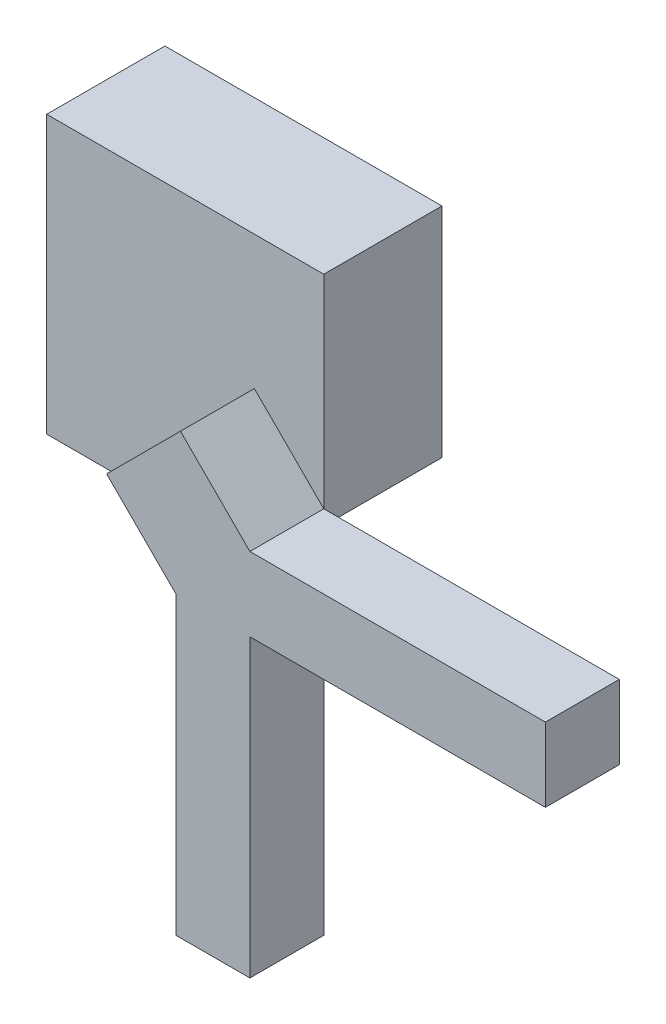
ISO-10303-21;
HEADER;
FILE_DESCRIPTION(('STEP AP214'),'2;1');
FILE_NAME('part.step','',(''),(''),'','','');
FILE_SCHEMA(('AUTOMOTIVE_DESIGN { 1 0 10303 214 1 1 1 1 }'));
ENDSEC;
DATA;
#1=APPLICATION_CONTEXT('core data for automotive mechanical design processes');
#2=APPLICATION_PROTOCOL_DEFINITION('international standard','automotive_design',2000,#1);
#3=PRODUCT_CONTEXT('',#1,'mechanical');
#4=PRODUCT('Part','Part','',(#3));
#5=PRODUCT_RELATED_PRODUCT_CATEGORY('part','',(#4));
#6=PRODUCT_DEFINITION_FORMATION('','',#4);
#7=PRODUCT_DEFINITION_CONTEXT('part definition',#1,'design');
#8=PRODUCT_DEFINITION('design','',#6,#7);
#9=PRODUCT_DEFINITION_SHAPE('','',#8);
#10=(LENGTH_UNIT() NAMED_UNIT(*) SI_UNIT(.MILLI.,.METRE.));
#11=(NAMED_UNIT(*) PLANE_ANGLE_UNIT() SI_UNIT($,.RADIAN.));
#12=(NAMED_UNIT(*) SI_UNIT($,.STERADIAN.) SOLID_ANGLE_UNIT());
#13=UNCERTAINTY_MEASURE_WITH_UNIT(LENGTH_MEASURE(1.E-05),#10,'distance_accuracy_value','');
#14=(GEOMETRIC_REPRESENTATION_CONTEXT(3) GLOBAL_UNCERTAINTY_ASSIGNED_CONTEXT((#13)) GLOBAL_UNIT_ASSIGNED_CONTEXT((#10,
#11,#12)) REPRESENTATION_CONTEXT('',''));
#15=CARTESIAN_POINT('',(0.,0.,0.));
#16=DIRECTION('',(0.,0.,1.));
#17=DIRECTION('',(1.,0.,0.));
#18=AXIS2_PLACEMENT_3D('',#15,#16,#17);
#19=CARTESIAN_POINT('',(9.375,9.375,8.));
#20=DIRECTION('',(-1.,0.,0.));
#21=DIRECTION('',(0.,-1.,0.));
#22=AXIS2_PLACEMENT_3D('',#19,#20,#21);
#23=PLANE('',#22);
#24=DIRECTION('',(0.,0.,-1.));
#25=VECTOR('',#24,1.);
#26=CARTESIAN_POINT('',(9.375,-5.375,13.6568542494924));
#27=LINE('',#26,#25);
#28=CARTESIAN_POINT('',(9.375,-5.375,8.));
#29=VERTEX_POINT('',#28);
#30=CARTESIAN_POINT('',(9.375,-5.375,0.));
#31=VERTEX_POINT('',#30);
#32=EDGE_CURVE('E51',#29,#31,#27,.T.);
#33=ORIENTED_EDGE('',*,*,#32,.T.);
#34=DIRECTION('',(0.,1.,0.));
#35=VECTOR('',#34,1.);
#36=CARTESIAN_POINT('',(9.375,9.375,0.));
#37=LINE('',#36,#35);
#38=CARTESIAN_POINT('',(9.375,9.375,0.));
#39=VERTEX_POINT('',#38);
#40=EDGE_CURVE('E186',#31,#39,#37,.T.);
#41=ORIENTED_EDGE('',*,*,#40,.T.);
#42=DIRECTION('',(0.,0.,-1.));
#43=VECTOR('',#42,1.);
#44=CARTESIAN_POINT('',(9.375,9.375,8.));
#45=LINE('',#44,#43);
#46=CARTESIAN_POINT('',(9.375,9.375,8.));
#47=VERTEX_POINT('',#46);
#48=EDGE_CURVE('E11',#47,#39,#45,.T.);
#49=ORIENTED_EDGE('',*,*,#48,.F.);
#50=DIRECTION('',(0.,1.,0.));
#51=VECTOR('',#50,1.);
#52=CARTESIAN_POINT('',(9.375,-4.375,8.));
#53=LINE('',#52,#51);
#54=CARTESIAN_POINT('',(9.375,-4.375,8.));
#55=VERTEX_POINT('',#54);
#56=EDGE_CURVE('E171',#55,#47,#53,.T.);
#57=ORIENTED_EDGE('',*,*,#56,.F.);
#58=EDGE_CURVE('E178',#29,#55,#53,.T.);
#59=ORIENTED_EDGE('',*,*,#58,.F.);
#60=EDGE_LOOP('',(#33,#41,#49,#57,#59));
#61=FACE_BOUND('',#60,.T.);
#62=ADVANCED_FACE('F37',(#61),#23,.F.);
#63=CARTESIAN_POINT('',(-9.375,-9.375,8.));
#64=DIRECTION('',(0.,1.,0.));
#65=DIRECTION('',(-1.,0.,0.));
#66=AXIS2_PLACEMENT_3D('',#63,#64,#65);
#67=PLANE('',#66);
#68=DIRECTION('',(0.,0.,-1.));
#69=VECTOR('',#68,1.);
#70=CARTESIAN_POINT('',(5.375,-9.375,13.6568542494924));
#71=LINE('',#70,#69);
#72=CARTESIAN_POINT('',(5.375,-9.375,8.));
#73=VERTEX_POINT('',#72);
#74=CARTESIAN_POINT('',(5.375,-9.375,0.));
#75=VERTEX_POINT('',#74);
#76=EDGE_CURVE('E148',#73,#75,#71,.T.);
#77=ORIENTED_EDGE('',*,*,#76,.F.);
#78=DIRECTION('',(1.,0.,0.));
#79=VECTOR('',#78,1.);
#80=CARTESIAN_POINT('',(4.375,-9.375,8.));
#81=LINE('',#80,#79);
#82=CARTESIAN_POINT('',(4.375,-9.375,8.));
#83=VERTEX_POINT('',#82);
#84=EDGE_CURVE('E159',#83,#73,#81,.T.);
#85=ORIENTED_EDGE('',*,*,#84,.F.);
#86=CARTESIAN_POINT('',(-9.375,-9.375,8.));
#87=VERTEX_POINT('',#86);
#88=EDGE_CURVE('E169',#87,#83,#81,.T.);
#89=ORIENTED_EDGE('',*,*,#88,.F.);
#90=DIRECTION('',(0.,0.,-1.));
#91=VECTOR('',#90,1.);
#92=CARTESIAN_POINT('',(-9.375,-9.375,8.));
#93=LINE('',#92,#91);
#94=CARTESIAN_POINT('',(-9.375,-9.375,0.));
#95=VERTEX_POINT('',#94);
#96=EDGE_CURVE('E185',#87,#95,#93,.T.);
#97=ORIENTED_EDGE('',*,*,#96,.T.);
#98=DIRECTION('',(1.,0.,0.));
#99=VECTOR('',#98,1.);
#100=CARTESIAN_POINT('',(-9.375,-9.375,0.));
#101=LINE('',#100,#99);
#102=EDGE_CURVE('E162',#95,#75,#101,.T.);
#103=ORIENTED_EDGE('',*,*,#102,.T.);
#104=EDGE_LOOP('',(#77,#85,#89,#97,#103));
#105=FACE_BOUND('',#104,.T.);
#106=ADVANCED_FACE('F158',(#105),#67,.F.);
#107=CARTESIAN_POINT('',(0.,0.,0.));
#108=DIRECTION('',(0.,0.,-1.));
#109=DIRECTION('',(-1.,0.,0.));
#110=AXIS2_PLACEMENT_3D('',#107,#108,#109);
#111=PLANE('',#110);
#112=ORIENTED_EDGE('',*,*,#40,.F.);
#113=DIRECTION('',(-1.,0.,0.));
#114=VECTOR('',#113,1.);
#115=CARTESIAN_POINT('',(9.375,-5.375,0.));
#116=LINE('',#115,#114);
#117=CARTESIAN_POINT('',(5.375,-5.375,0.));
#118=VERTEX_POINT('',#117);
#119=EDGE_CURVE('E205',#31,#118,#116,.T.);
#120=ORIENTED_EDGE('',*,*,#119,.T.);
#121=DIRECTION('',(0.,-1.,0.));
#122=VECTOR('',#121,1.);
#123=CARTESIAN_POINT('',(5.375,-9.375,0.));
#124=LINE('',#123,#122);
#125=EDGE_CURVE('E163',#118,#75,#124,.T.);
#126=ORIENTED_EDGE('',*,*,#125,.T.);
#127=ORIENTED_EDGE('',*,*,#102,.F.);
#128=DIRECTION('',(0.,-1.,0.));
#129=VECTOR('',#128,1.);
#130=CARTESIAN_POINT('',(-9.375,9.375,0.));
#131=LINE('',#130,#129);
#132=CARTESIAN_POINT('',(-9.375,9.375,0.));
#133=VERTEX_POINT('',#132);
#134=EDGE_CURVE('E172',#133,#95,#131,.T.);
#135=ORIENTED_EDGE('',*,*,#134,.F.);
#136=DIRECTION('',(-1.,0.,0.));
#137=VECTOR('',#136,1.);
#138=CARTESIAN_POINT('',(-9.375,9.375,0.));
#139=LINE('',#138,#137);
#140=EDGE_CURVE('E188',#39,#133,#139,.T.);
#141=ORIENTED_EDGE('',*,*,#140,.F.);
#142=EDGE_LOOP('',(#112,#120,#126,#127,#135,#141));
#143=FACE_BOUND('',#142,.T.);
#144=ADVANCED_FACE('F203',(#143),#111,.T.);
#145=CARTESIAN_POINT('',(0.,0.,8.));
#146=DIRECTION('',(0.,0.,-1.));
#147=DIRECTION('',(-1.,0.,0.));
#148=AXIS2_PLACEMENT_3D('',#145,#146,#147);
#149=PLANE('',#148);
#150=DIRECTION('',(0.707106781186546,-0.707106781186549,0.));
#151=VECTOR('',#150,1.);
#152=CARTESIAN_POINT('',(-2.49999999999999,-2.49999999999998,8.));
#153=LINE('',#152,#151);
#154=CARTESIAN_POINT('',(-0.322905118241525,-4.67709488175846,8.));
#155=VERTEX_POINT('',#154);
#156=EDGE_CURVE('E59',#155,#83,#153,.T.);
#157=ORIENTED_EDGE('',*,*,#156,.F.);
#158=DIRECTION('',(-0.707106781186548,-0.707106781186547,0.));
#159=VECTOR('',#158,1.);
#160=CARTESIAN_POINT('',(2.17709488175847,-2.17709488175847,8.));
#161=LINE('',#160,#159);
#162=CARTESIAN_POINT('',(4.67709488175847,0.322905118241538,8.));
#163=VERTEX_POINT('',#162);
#164=EDGE_CURVE('E238',#163,#155,#161,.T.);
#165=ORIENTED_EDGE('',*,*,#164,.F.);
#166=DIRECTION('',(-0.707106781186547,0.707106781186548,0.));
#167=VECTOR('',#166,1.);
#168=CARTESIAN_POINT('',(2.50000000000001,2.5,8.));
#169=LINE('',#168,#167);
#170=EDGE_CURVE('E235',#55,#163,#169,.T.);
#171=ORIENTED_EDGE('',*,*,#170,.F.);
#172=ORIENTED_EDGE('',*,*,#56,.T.);
#173=DIRECTION('',(-1.,0.,0.));
#174=VECTOR('',#173,1.);
#175=CARTESIAN_POINT('',(-9.375,9.375,8.));
#176=LINE('',#175,#174);
#177=CARTESIAN_POINT('',(-9.375,9.375,8.));
#178=VERTEX_POINT('',#177);
#179=EDGE_CURVE('E180',#47,#178,#176,.T.);
#180=ORIENTED_EDGE('',*,*,#179,.T.);
#181=DIRECTION('',(0.,-1.,0.));
#182=VECTOR('',#181,1.);
#183=CARTESIAN_POINT('',(-9.375,9.375,8.));
#184=LINE('',#183,#182);
#185=EDGE_CURVE('E182',#178,#87,#184,.T.);
#186=ORIENTED_EDGE('',*,*,#185,.T.);
#187=ORIENTED_EDGE('',*,*,#88,.T.);
#188=EDGE_LOOP('',(#157,#165,#171,#172,#180,#186,#187));
#189=FACE_BOUND('',#188,.T.);
#190=ADVANCED_FACE('F288',(#189),#149,.F.);
#191=CARTESIAN_POINT('',(-9.375,9.375,8.));
#192=DIRECTION('',(0.,-1.,0.));
#193=DIRECTION('',(0.,0.,-1.));
#194=AXIS2_PLACEMENT_3D('',#191,#192,#193);
#195=PLANE('',#194);
#196=ORIENTED_EDGE('',*,*,#140,.T.);
#197=DIRECTION('',(0.,0.,-1.));
#198=VECTOR('',#197,1.);
#199=CARTESIAN_POINT('',(-9.375,9.375,8.));
#200=LINE('',#199,#198);
#201=EDGE_CURVE('E44',#178,#133,#200,.T.);
#202=ORIENTED_EDGE('',*,*,#201,.F.);
#203=ORIENTED_EDGE('',*,*,#179,.F.);
#204=ORIENTED_EDGE('',*,*,#48,.T.);
#205=EDGE_LOOP('',(#196,#202,#203,#204));
#206=FACE_BOUND('',#205,.T.);
#207=ADVANCED_FACE('F290',(#206),#195,.F.);
#208=CARTESIAN_POINT('',(-9.375,9.375,8.));
#209=DIRECTION('',(1.,0.,0.));
#210=DIRECTION('',(0.,1.,0.));
#211=AXIS2_PLACEMENT_3D('',#208,#209,#210);
#212=PLANE('',#211);
#213=ORIENTED_EDGE('',*,*,#134,.T.);
#214=ORIENTED_EDGE('',*,*,#96,.F.);
#215=ORIENTED_EDGE('',*,*,#185,.F.);
#216=ORIENTED_EDGE('',*,*,#201,.T.);
#217=EDGE_LOOP('',(#213,#214,#215,#216));
#218=FACE_BOUND('',#217,.T.);
#219=ADVANCED_FACE('F196',(#218),#212,.F.);
#220=CARTESIAN_POINT('',(0.,0.,8.));
#221=DIRECTION('',(0.,0.,1.));
#222=DIRECTION('',(1.,0.,0.));
#223=AXIS2_PLACEMENT_3D('',#220,#221,#222);
#224=PLANE('',#223);
#225=DIRECTION('',(0.,-1.,0.));
#226=VECTOR('',#225,1.);
#227=CARTESIAN_POINT('',(4.375,0.,8.));
#228=LINE('',#227,#226);
#229=CARTESIAN_POINT('',(4.375,-29.375,8.));
#230=VERTEX_POINT('',#229);
#231=EDGE_CURVE('E168',#83,#230,#228,.T.);
#232=ORIENTED_EDGE('',*,*,#231,.F.);
#233=ORIENTED_EDGE('',*,*,#84,.T.);
#234=DIRECTION('',(0.,-1.,0.));
#235=VECTOR('',#234,1.);
#236=CARTESIAN_POINT('',(5.375,-9.375,8.));
#237=LINE('',#236,#235);
#238=CARTESIAN_POINT('',(5.375,-5.375,8.));
#239=VERTEX_POINT('',#238);
#240=EDGE_CURVE('E144',#239,#73,#237,.T.);
#241=ORIENTED_EDGE('',*,*,#240,.F.);
#242=DIRECTION('',(-1.,0.,0.));
#243=VECTOR('',#242,1.);
#244=CARTESIAN_POINT('',(9.375,-5.375,8.));
#245=LINE('',#244,#243);
#246=EDGE_CURVE('E154',#29,#239,#245,.T.);
#247=ORIENTED_EDGE('',*,*,#246,.F.);
#248=ORIENTED_EDGE('',*,*,#58,.T.);
#249=DIRECTION('',(-1.,0.,0.));
#250=VECTOR('',#249,1.);
#251=CARTESIAN_POINT('',(0.,-4.375,8.));
#252=LINE('',#251,#250);
#253=CARTESIAN_POINT('',(29.375,-4.375,8.));
#254=VERTEX_POINT('',#253);
#255=EDGE_CURVE('E153',#254,#55,#252,.T.);
#256=ORIENTED_EDGE('',*,*,#255,.F.);
#257=DIRECTION('',(0.,1.,0.));
#258=VECTOR('',#257,1.);
#259=CARTESIAN_POINT('',(29.375,0.,8.));
#260=LINE('',#259,#258);
#261=CARTESIAN_POINT('',(29.375,-9.375,8.));
#262=VERTEX_POINT('',#261);
#263=EDGE_CURVE('E216',#262,#254,#260,.T.);
#264=ORIENTED_EDGE('',*,*,#263,.F.);
#265=DIRECTION('',(1.,0.,0.));
#266=VECTOR('',#265,1.);
#267=CARTESIAN_POINT('',(0.,-9.375,8.));
#268=LINE('',#267,#266);
#269=CARTESIAN_POINT('',(9.375,-9.375,8.));
#270=VERTEX_POINT('',#269);
#271=EDGE_CURVE('E246',#270,#262,#268,.T.);
#272=ORIENTED_EDGE('',*,*,#271,.F.);
#273=DIRECTION('',(0.,1.,0.));
#274=VECTOR('',#273,1.);
#275=CARTESIAN_POINT('',(9.375,0.,8.));
#276=LINE('',#275,#274);
#277=CARTESIAN_POINT('',(9.375,-29.375,8.));
#278=VERTEX_POINT('',#277);
#279=EDGE_CURVE('E244',#278,#270,#276,.T.);
#280=ORIENTED_EDGE('',*,*,#279,.F.);
#281=DIRECTION('',(1.,0.,0.));
#282=VECTOR('',#281,1.);
#283=CARTESIAN_POINT('',(0.,-29.375,8.));
#284=LINE('',#283,#282);
#285=EDGE_CURVE('E242',#230,#278,#284,.T.);
#286=ORIENTED_EDGE('',*,*,#285,.F.);
#287=EDGE_LOOP('',(#232,#233,#241,#247,#248,#256,#264,#272,#280,#286));
#288=FACE_BOUND('',#287,.T.);
#289=ADVANCED_FACE('F166',(#288),#224,.F.);
#290=CARTESIAN_POINT('',(0.,-4.375,13.));
#291=DIRECTION('',(0.,-1.,0.));
#292=DIRECTION('',(1.,0.,0.));
#293=AXIS2_PLACEMENT_3D('',#290,#291,#292);
#294=PLANE('',#293);
#295=ORIENTED_EDGE('',*,*,#255,.T.);
#296=DIRECTION('',(0.,0.,-1.));
#297=VECTOR('',#296,1.);
#298=CARTESIAN_POINT('',(9.375,-4.375,13.));
#299=LINE('',#298,#297);
#300=CARTESIAN_POINT('',(9.375,-4.375,13.));
#301=VERTEX_POINT('',#300);
#302=EDGE_CURVE('E176',#301,#55,#299,.T.);
#303=ORIENTED_EDGE('',*,*,#302,.F.);
#304=DIRECTION('',(-1.,0.,0.));
#305=VECTOR('',#304,1.);
#306=CARTESIAN_POINT('',(0.,-4.375,13.));
#307=LINE('',#306,#305);
#308=CARTESIAN_POINT('',(29.375,-4.375,13.));
#309=VERTEX_POINT('',#308);
#310=EDGE_CURVE('E212',#309,#301,#307,.T.);
#311=ORIENTED_EDGE('',*,*,#310,.F.);
#312=DIRECTION('',(0.,0.,-1.));
#313=VECTOR('',#312,1.);
#314=CARTESIAN_POINT('',(29.375,-4.375,13.));
#315=LINE('',#314,#313);
#316=EDGE_CURVE('E232',#309,#254,#315,.T.);
#317=ORIENTED_EDGE('',*,*,#316,.T.);
#318=EDGE_LOOP('',(#295,#303,#311,#317));
#319=FACE_BOUND('',#318,.T.);
#320=ADVANCED_FACE('F281',(#319),#294,.F.);
#321=CARTESIAN_POINT('',(2.50000000000001,2.5,13.));
#322=DIRECTION('',(-0.707106781186548,-0.707106781186547,0.));
#323=DIRECTION('',(0.707106781186547,-0.707106781186548,0.));
#324=AXIS2_PLACEMENT_3D('',#321,#322,#323);
#325=PLANE('',#324);
#326=ORIENTED_EDGE('',*,*,#170,.T.);
#327=DIRECTION('',(0.,0.,-1.));
#328=VECTOR('',#327,1.);
#329=CARTESIAN_POINT('',(4.67709488175847,0.322905118241538,13.));
#330=LINE('',#329,#328);
#331=CARTESIAN_POINT('',(4.67709488175847,0.322905118241538,13.));
#332=VERTEX_POINT('',#331);
#333=EDGE_CURVE('E268',#332,#163,#330,.T.);
#334=ORIENTED_EDGE('',*,*,#333,.F.);
#335=DIRECTION('',(-0.707106781186547,0.707106781186548,0.));
#336=VECTOR('',#335,1.);
#337=CARTESIAN_POINT('',(2.50000000000001,2.5,13.));
#338=LINE('',#337,#336);
#339=EDGE_CURVE('E215',#301,#332,#338,.T.);
#340=ORIENTED_EDGE('',*,*,#339,.F.);
#341=ORIENTED_EDGE('',*,*,#302,.T.);
#342=EDGE_LOOP('',(#326,#334,#340,#341));
#343=FACE_BOUND('',#342,.T.);
#344=ADVANCED_FACE('F276',(#343),#325,.F.);
#345=CARTESIAN_POINT('',(2.17709488175847,-2.17709488175847,13.));
#346=DIRECTION('',(0.707106781186547,-0.707106781186548,0.));
#347=DIRECTION('',(0.707106781186548,0.707106781186547,0.));
#348=AXIS2_PLACEMENT_3D('',#345,#346,#347);
#349=PLANE('',#348);
#350=ORIENTED_EDGE('',*,*,#164,.T.);
#351=DIRECTION('',(0.,0.,-1.));
#352=VECTOR('',#351,1.);
#353=CARTESIAN_POINT('',(-0.322905118241525,-4.67709488175846,13.));
#354=LINE('',#353,#352);
#355=CARTESIAN_POINT('',(-0.322905118241525,-4.67709488175846,13.));
#356=VERTEX_POINT('',#355);
#357=EDGE_CURVE('E266',#356,#155,#354,.T.);
#358=ORIENTED_EDGE('',*,*,#357,.F.);
#359=DIRECTION('',(-0.707106781186548,-0.707106781186547,0.));
#360=VECTOR('',#359,1.);
#361=CARTESIAN_POINT('',(2.17709488175847,-2.17709488175847,13.));
#362=LINE('',#361,#360);
#363=EDGE_CURVE('E218',#332,#356,#362,.T.);
#364=ORIENTED_EDGE('',*,*,#363,.F.);
#365=ORIENTED_EDGE('',*,*,#333,.T.);
#366=EDGE_LOOP('',(#350,#358,#364,#365));
#367=FACE_BOUND('',#366,.T.);
#368=ADVANCED_FACE('F304',(#367),#349,.F.);
#369=CARTESIAN_POINT('',(-2.49999999999999,-2.49999999999998,13.));
#370=DIRECTION('',(0.707106781186549,0.707106781186546,0.));
#371=DIRECTION('',(-0.707106781186546,0.707106781186549,0.));
#372=AXIS2_PLACEMENT_3D('',#369,#370,#371);
#373=PLANE('',#372);
#374=ORIENTED_EDGE('',*,*,#156,.T.);
#375=DIRECTION('',(0.,0.,-1.));
#376=VECTOR('',#375,1.);
#377=CARTESIAN_POINT('',(4.375,-9.375,13.));
#378=LINE('',#377,#376);
#379=CARTESIAN_POINT('',(4.375,-9.375,13.));
#380=VERTEX_POINT('',#379);
#381=EDGE_CURVE('E263',#380,#83,#378,.T.);
#382=ORIENTED_EDGE('',*,*,#381,.F.);
#383=DIRECTION('',(0.707106781186546,-0.707106781186549,0.));
#384=VECTOR('',#383,1.);
#385=CARTESIAN_POINT('',(-2.49999999999999,-2.49999999999998,13.));
#386=LINE('',#385,#384);
#387=EDGE_CURVE('E220',#356,#380,#386,.T.);
#388=ORIENTED_EDGE('',*,*,#387,.F.);
#389=ORIENTED_EDGE('',*,*,#357,.T.);
#390=EDGE_LOOP('',(#374,#382,#388,#389));
#391=FACE_BOUND('',#390,.T.);
#392=ADVANCED_FACE('F293',(#391),#373,.F.);
#393=CARTESIAN_POINT('',(4.375,0.,13.));
#394=DIRECTION('',(1.,0.,0.));
#395=DIRECTION('',(0.,1.,0.));
#396=AXIS2_PLACEMENT_3D('',#393,#394,#395);
#397=PLANE('',#396);
#398=ORIENTED_EDGE('',*,*,#231,.T.);
#399=DIRECTION('',(0.,0.,-1.));
#400=VECTOR('',#399,1.);
#401=CARTESIAN_POINT('',(4.375,-29.375,13.));
#402=LINE('',#401,#400);
#403=CARTESIAN_POINT('',(4.375,-29.375,13.));
#404=VERTEX_POINT('',#403);
#405=EDGE_CURVE('E260',#404,#230,#402,.T.);
#406=ORIENTED_EDGE('',*,*,#405,.F.);
#407=DIRECTION('',(0.,-1.,0.));
#408=VECTOR('',#407,1.);
#409=CARTESIAN_POINT('',(4.375,0.,13.));
#410=LINE('',#409,#408);
#411=EDGE_CURVE('E222',#380,#404,#410,.T.);
#412=ORIENTED_EDGE('',*,*,#411,.F.);
#413=ORIENTED_EDGE('',*,*,#381,.T.);
#414=EDGE_LOOP('',(#398,#406,#412,#413));
#415=FACE_BOUND('',#414,.T.);
#416=ADVANCED_FACE('F298',(#415),#397,.F.);
#417=CARTESIAN_POINT('',(0.,-29.375,13.));
#418=DIRECTION('',(0.,1.,0.));
#419=DIRECTION('',(0.,0.,1.));
#420=AXIS2_PLACEMENT_3D('',#417,#418,#419);
#421=PLANE('',#420);
#422=ORIENTED_EDGE('',*,*,#285,.T.);
#423=DIRECTION('',(0.,0.,-1.));
#424=VECTOR('',#423,1.);
#425=CARTESIAN_POINT('',(9.375,-29.375,13.));
#426=LINE('',#425,#424);
#427=CARTESIAN_POINT('',(9.375,-29.375,13.));
#428=VERTEX_POINT('',#427);
#429=EDGE_CURVE('E257',#428,#278,#426,.T.);
#430=ORIENTED_EDGE('',*,*,#429,.F.);
#431=DIRECTION('',(1.,0.,0.));
#432=VECTOR('',#431,1.);
#433=CARTESIAN_POINT('',(0.,-29.375,13.));
#434=LINE('',#433,#432);
#435=EDGE_CURVE('E224',#404,#428,#434,.T.);
#436=ORIENTED_EDGE('',*,*,#435,.F.);
#437=ORIENTED_EDGE('',*,*,#405,.T.);
#438=EDGE_LOOP('',(#422,#430,#436,#437));
#439=FACE_BOUND('',#438,.T.);
#440=ADVANCED_FACE('F353',(#439),#421,.F.);
#441=CARTESIAN_POINT('',(9.375,0.,13.));
#442=DIRECTION('',(-1.,0.,0.));
#443=DIRECTION('',(0.,-1.,0.));
#444=AXIS2_PLACEMENT_3D('',#441,#442,#443);
#445=PLANE('',#444);
#446=ORIENTED_EDGE('',*,*,#279,.T.);
#447=DIRECTION('',(0.,0.,-1.));
#448=VECTOR('',#447,1.);
#449=CARTESIAN_POINT('',(9.375,-9.375,13.));
#450=LINE('',#449,#448);
#451=CARTESIAN_POINT('',(9.375,-9.375,13.));
#452=VERTEX_POINT('',#451);
#453=EDGE_CURVE('E254',#452,#270,#450,.T.);
#454=ORIENTED_EDGE('',*,*,#453,.F.);
#455=DIRECTION('',(0.,1.,0.));
#456=VECTOR('',#455,1.);
#457=CARTESIAN_POINT('',(9.375,0.,13.));
#458=LINE('',#457,#456);
#459=EDGE_CURVE('E226',#428,#452,#458,.T.);
#460=ORIENTED_EDGE('',*,*,#459,.F.);
#461=ORIENTED_EDGE('',*,*,#429,.T.);
#462=EDGE_LOOP('',(#446,#454,#460,#461));
#463=FACE_BOUND('',#462,.T.);
#464=ADVANCED_FACE('F349',(#463),#445,.F.);
#465=CARTESIAN_POINT('',(0.,-9.375,13.));
#466=DIRECTION('',(0.,1.,0.));
#467=DIRECTION('',(-1.,0.,0.));
#468=AXIS2_PLACEMENT_3D('',#465,#466,#467);
#469=PLANE('',#468);
#470=ORIENTED_EDGE('',*,*,#271,.T.);
#471=DIRECTION('',(0.,0.,-1.));
#472=VECTOR('',#471,1.);
#473=CARTESIAN_POINT('',(29.375,-9.375,13.));
#474=LINE('',#473,#472);
#475=CARTESIAN_POINT('',(29.375,-9.375,13.));
#476=VERTEX_POINT('',#475);
#477=EDGE_CURVE('E251',#476,#262,#474,.T.);
#478=ORIENTED_EDGE('',*,*,#477,.F.);
#479=DIRECTION('',(1.,0.,0.));
#480=VECTOR('',#479,1.);
#481=CARTESIAN_POINT('',(0.,-9.375,13.));
#482=LINE('',#481,#480);
#483=EDGE_CURVE('E228',#452,#476,#482,.T.);
#484=ORIENTED_EDGE('',*,*,#483,.F.);
#485=ORIENTED_EDGE('',*,*,#453,.T.);
#486=EDGE_LOOP('',(#470,#478,#484,#485));
#487=FACE_BOUND('',#486,.T.);
#488=ADVANCED_FACE('F345',(#487),#469,.F.);
#489=CARTESIAN_POINT('',(29.375,0.,13.));
#490=DIRECTION('',(-1.,0.,0.));
#491=DIRECTION('',(0.,0.,1.));
#492=AXIS2_PLACEMENT_3D('',#489,#490,#491);
#493=PLANE('',#492);
#494=ORIENTED_EDGE('',*,*,#263,.T.);
#495=ORIENTED_EDGE('',*,*,#316,.F.);
#496=DIRECTION('',(0.,1.,0.));
#497=VECTOR('',#496,1.);
#498=CARTESIAN_POINT('',(29.375,0.,13.));
#499=LINE('',#498,#497);
#500=EDGE_CURVE('E230',#476,#309,#499,.T.);
#501=ORIENTED_EDGE('',*,*,#500,.F.);
#502=ORIENTED_EDGE('',*,*,#477,.T.);
#503=EDGE_LOOP('',(#494,#495,#501,#502));
#504=FACE_BOUND('',#503,.T.);
#505=ADVANCED_FACE('F342',(#504),#493,.F.);
#506=CARTESIAN_POINT('',(0.,0.,13.));
#507=DIRECTION('',(0.,0.,1.));
#508=DIRECTION('',(1.,0.,0.));
#509=AXIS2_PLACEMENT_3D('',#506,#507,#508);
#510=PLANE('',#509);
#511=ORIENTED_EDGE('',*,*,#310,.T.);
#512=ORIENTED_EDGE('',*,*,#339,.T.);
#513=ORIENTED_EDGE('',*,*,#363,.T.);
#514=ORIENTED_EDGE('',*,*,#387,.T.);
#515=ORIENTED_EDGE('',*,*,#411,.T.);
#516=ORIENTED_EDGE('',*,*,#435,.T.);
#517=ORIENTED_EDGE('',*,*,#459,.T.);
#518=ORIENTED_EDGE('',*,*,#483,.T.);
#519=ORIENTED_EDGE('',*,*,#500,.T.);
#520=EDGE_LOOP('',(#511,#512,#513,#514,#515,#516,#517,#518,#519));
#521=FACE_BOUND('',#520,.T.);
#522=ADVANCED_FACE('F302',(#521),#510,.T.);
#523=CARTESIAN_POINT('',(9.375,-5.375,13.6568542494924));
#524=DIRECTION('',(0.,-1.,0.));
#525=DIRECTION('',(1.,0.,0.));
#526=AXIS2_PLACEMENT_3D('',#523,#524,#525);
#527=PLANE('',#526);
#528=ORIENTED_EDGE('',*,*,#246,.T.);
#529=DIRECTION('',(0.,0.,-1.));
#530=VECTOR('',#529,1.);
#531=CARTESIAN_POINT('',(5.375,-5.375,13.6568542494924));
#532=LINE('',#531,#530);
#533=EDGE_CURVE('E150',#239,#118,#532,.T.);
#534=ORIENTED_EDGE('',*,*,#533,.T.);
#535=ORIENTED_EDGE('',*,*,#119,.F.);
#536=ORIENTED_EDGE('',*,*,#32,.F.);
#537=EDGE_LOOP('',(#528,#534,#535,#536));
#538=FACE_BOUND('',#537,.T.);
#539=ADVANCED_FACE('F386',(#538),#527,.T.);
#540=CARTESIAN_POINT('',(5.375,-9.375,13.6568542494924));
#541=DIRECTION('',(1.,0.,0.));
#542=DIRECTION('',(0.,0.,-1.));
#543=AXIS2_PLACEMENT_3D('',#540,#541,#542);
#544=PLANE('',#543);
#545=ORIENTED_EDGE('',*,*,#240,.T.);
#546=ORIENTED_EDGE('',*,*,#76,.T.);
#547=ORIENTED_EDGE('',*,*,#125,.F.);
#548=ORIENTED_EDGE('',*,*,#533,.F.);
#549=EDGE_LOOP('',(#545,#546,#547,#548));
#550=FACE_BOUND('',#549,.T.);
#551=ADVANCED_FACE('F146',(#550),#544,.T.);
#552=CLOSED_SHELL('',(#62,#106,#144,#190,#207,#219,#289,#320,#344,#368,#392,#416,#440,#464,#488,
#505,#522,#539,#551));
#553=MANIFOLD_SOLID_BREP('B2',#552);
#554=ADVANCED_BREP_SHAPE_REPRESENTATION('',(#18,#553),#14);
#555=SHAPE_DEFINITION_REPRESENTATION(#9,#554);
ENDSEC;
END-ISO-10303-21;
